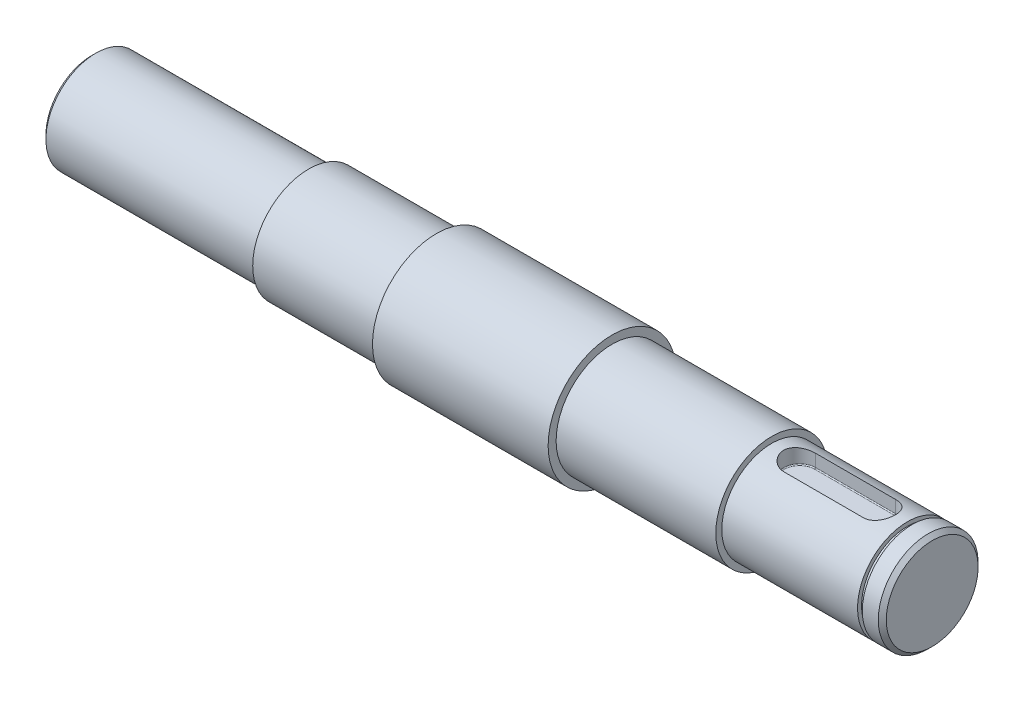
ISO-10303-21;
HEADER;
FILE_DESCRIPTION(('STEP AP214'),'2;1');
FILE_NAME('part.step','',(''),(''),'','','');
FILE_SCHEMA(('AUTOMOTIVE_DESIGN { 1 0 10303 214 1 1 1 1 }'));
ENDSEC;
DATA;
#1=APPLICATION_CONTEXT('core data for automotive mechanical design processes');
#2=APPLICATION_PROTOCOL_DEFINITION('international standard','automotive_design',2000,#1);
#3=PRODUCT_CONTEXT('',#1,'mechanical');
#4=PRODUCT('Part','Part','',(#3));
#5=PRODUCT_RELATED_PRODUCT_CATEGORY('part','',(#4));
#6=PRODUCT_DEFINITION_FORMATION('','',#4);
#7=PRODUCT_DEFINITION_CONTEXT('part definition',#1,'design');
#8=PRODUCT_DEFINITION('design','',#6,#7);
#9=PRODUCT_DEFINITION_SHAPE('','',#8);
#10=(LENGTH_UNIT() NAMED_UNIT(*) SI_UNIT(.MILLI.,.METRE.));
#11=(NAMED_UNIT(*) PLANE_ANGLE_UNIT() SI_UNIT($,.RADIAN.));
#12=(NAMED_UNIT(*) SI_UNIT($,.STERADIAN.) SOLID_ANGLE_UNIT());
#13=UNCERTAINTY_MEASURE_WITH_UNIT(LENGTH_MEASURE(1.E-05),#10,'distance_accuracy_value','');
#14=(GEOMETRIC_REPRESENTATION_CONTEXT(3) GLOBAL_UNCERTAINTY_ASSIGNED_CONTEXT((#13)) GLOBAL_UNIT_ASSIGNED_CONTEXT((#10,
#11,#12)) REPRESENTATION_CONTEXT('',''));
#15=CARTESIAN_POINT('',(0.,0.,0.));
#16=DIRECTION('',(0.,0.,1.));
#17=DIRECTION('',(1.,0.,0.));
#18=AXIS2_PLACEMENT_3D('',#15,#16,#17);
#19=CARTESIAN_POINT('',(210.,0.,0.));
#20=DIRECTION('',(-1.,0.,0.));
#21=DIRECTION('',(0.,0.,-1.));
#22=AXIS2_PLACEMENT_3D('',#19,#20,#21);
#23=CONICAL_SURFACE('',#22,12.,0.785398163397448);
#24=CARTESIAN_POINT('',(210.5,0.,0.));
#25=DIRECTION('',(1.,0.,0.));
#26=DIRECTION('',(0.,0.,1.));
#27=AXIS2_PLACEMENT_3D('',#24,#25,#26);
#28=CIRCLE('',#27,11.5);
#29=CARTESIAN_POINT('',(210.5,0.,11.5));
#30=VERTEX_POINT('',#29);
#31=EDGE_CURVE('E193',#30,#30,#28,.T.);
#32=ORIENTED_EDGE('',*,*,#31,.F.);
#33=EDGE_LOOP('',(#32));
#34=FACE_BOUND('',#33,.T.);
#35=CARTESIAN_POINT('',(209.5,0.,0.));
#36=DIRECTION('',(1.,0.,0.));
#37=DIRECTION('',(0.,0.,1.));
#38=AXIS2_PLACEMENT_3D('',#35,#36,#37);
#39=CIRCLE('',#38,12.5);
#40=CARTESIAN_POINT('',(209.5,0.,12.5));
#41=VERTEX_POINT('',#40);
#42=EDGE_CURVE('E280',#41,#41,#39,.T.);
#43=ORIENTED_EDGE('',*,*,#42,.T.);
#44=EDGE_LOOP('',(#43));
#45=FACE_BOUND('',#44,.T.);
#46=ADVANCED_FACE('F16',(#34,#45),#23,.T.);
#47=CARTESIAN_POINT('',(0.,0.,0.));
#48=DIRECTION('',(-1.,0.,0.));
#49=DIRECTION('',(0.,1.,0.));
#50=AXIS2_PLACEMENT_3D('',#47,#48,#49);
#51=PLANE('',#50);
#52=CARTESIAN_POINT('',(0.,0.,0.));
#53=DIRECTION('',(-1.,0.,0.));
#54=DIRECTION('',(0.,0.,-1.));
#55=AXIS2_PLACEMENT_3D('',#52,#53,#54);
#56=CIRCLE('',#55,11.5);
#57=CARTESIAN_POINT('',(0.,0.,-11.5));
#58=VERTEX_POINT('',#57);
#59=EDGE_CURVE('E10',#58,#58,#56,.T.);
#60=ORIENTED_EDGE('',*,*,#59,.T.);
#61=EDGE_LOOP('',(#60));
#62=FACE_BOUND('',#61,.T.);
#63=ADVANCED_FACE('F310',(#62),#51,.T.);
#64=CARTESIAN_POINT('',(0.5,0.,0.));
#65=DIRECTION('',(1.,0.,0.));
#66=DIRECTION('',(0.,0.,1.));
#67=AXIS2_PLACEMENT_3D('',#64,#65,#66);
#68=CONICAL_SURFACE('',#67,12.,0.785398163397448);
#69=CARTESIAN_POINT('',(1.,0.,0.));
#70=DIRECTION('',(-1.,0.,0.));
#71=DIRECTION('',(0.,0.,-1.));
#72=AXIS2_PLACEMENT_3D('',#69,#70,#71);
#73=CIRCLE('',#72,12.5);
#74=CARTESIAN_POINT('',(1.,0.,-12.5));
#75=VERTEX_POINT('',#74);
#76=EDGE_CURVE('E25',#75,#75,#73,.T.);
#77=ORIENTED_EDGE('',*,*,#76,.T.);
#78=EDGE_LOOP('',(#77));
#79=FACE_BOUND('',#78,.T.);
#80=ORIENTED_EDGE('',*,*,#59,.F.);
#81=EDGE_LOOP('',(#80));
#82=FACE_BOUND('',#81,.T.);
#83=ADVANCED_FACE('F306',(#79,#82),#68,.T.);
#84=CARTESIAN_POINT('',(54.3,0.,0.));
#85=DIRECTION('',(-1.,0.,0.));
#86=DIRECTION('',(0.,0.,-1.));
#87=AXIS2_PLACEMENT_3D('',#84,#85,#86);
#88=CYLINDRICAL_SURFACE('',#87,12.5);
#89=CARTESIAN_POINT('',(54.3,0.,0.));
#90=DIRECTION('',(1.,0.,0.));
#91=DIRECTION('',(0.,0.,-1.));
#92=AXIS2_PLACEMENT_3D('',#89,#90,#91);
#93=CIRCLE('',#92,12.5);
#94=CARTESIAN_POINT('',(54.3,0.,-12.5));
#95=VERTEX_POINT('',#94);
#96=EDGE_CURVE('E19',#95,#95,#93,.T.);
#97=ORIENTED_EDGE('',*,*,#96,.F.);
#98=EDGE_LOOP('',(#97));
#99=FACE_BOUND('',#98,.T.);
#100=ORIENTED_EDGE('',*,*,#76,.F.);
#101=EDGE_LOOP('',(#100));
#102=FACE_BOUND('',#101,.T.);
#103=ADVANCED_FACE('F299',(#99,#102),#88,.T.);
#104=CARTESIAN_POINT('',(54.3,0.,0.));
#105=DIRECTION('',(1.,0.,0.));
#106=DIRECTION('',(0.,0.,-1.));
#107=AXIS2_PLACEMENT_3D('',#104,#105,#106);
#108=PLANE('',#107);
#109=ORIENTED_EDGE('',*,*,#96,.T.);
#110=EDGE_LOOP('',(#109));
#111=FACE_BOUND('',#110,.T.);
#112=CARTESIAN_POINT('',(54.3,0.,0.));
#113=DIRECTION('',(1.,0.,0.));
#114=DIRECTION('',(0.,0.,1.));
#115=AXIS2_PLACEMENT_3D('',#112,#113,#114);
#116=CIRCLE('',#115,14.);
#117=CARTESIAN_POINT('',(54.3,0.,14.));
#118=VERTEX_POINT('',#117);
#119=EDGE_CURVE('E190',#118,#118,#116,.T.);
#120=ORIENTED_EDGE('',*,*,#119,.F.);
#121=EDGE_LOOP('',(#120));
#122=FACE_BOUND('',#121,.T.);
#123=ADVANCED_FACE('F294',(#111,#122),#108,.F.);
#124=CARTESIAN_POINT('',(54.3,0.,0.));
#125=DIRECTION('',(1.,0.,0.));
#126=DIRECTION('',(0.,0.,1.));
#127=AXIS2_PLACEMENT_3D('',#124,#125,#126);
#128=CYLINDRICAL_SURFACE('',#127,14.);
#129=CARTESIAN_POINT('',(86.3,0.,0.));
#130=DIRECTION('',(1.,0.,0.));
#131=DIRECTION('',(0.,0.,1.));
#132=AXIS2_PLACEMENT_3D('',#129,#130,#131);
#133=CIRCLE('',#132,14.);
#134=CARTESIAN_POINT('',(86.3,0.,14.));
#135=VERTEX_POINT('',#134);
#136=EDGE_CURVE('E248',#135,#135,#133,.T.);
#137=ORIENTED_EDGE('',*,*,#136,.F.);
#138=EDGE_LOOP('',(#137));
#139=FACE_BOUND('',#138,.T.);
#140=ORIENTED_EDGE('',*,*,#119,.T.);
#141=EDGE_LOOP('',(#140));
#142=FACE_BOUND('',#141,.T.);
#143=ADVANCED_FACE('F290',(#139,#142),#128,.T.);
#144=CARTESIAN_POINT('',(210.5,0.,0.));
#145=DIRECTION('',(1.,0.,0.));
#146=DIRECTION('',(0.,0.,-1.));
#147=AXIS2_PLACEMENT_3D('',#144,#145,#146);
#148=PLANE('',#147);
#149=ORIENTED_EDGE('',*,*,#31,.T.);
#150=EDGE_LOOP('',(#149));
#151=FACE_BOUND('',#150,.T.);
#152=ADVANCED_FACE('F293',(#151),#148,.T.);
#153=CARTESIAN_POINT('',(86.3,0.,0.));
#154=DIRECTION('',(1.,0.,0.));
#155=DIRECTION('',(0.,0.,-1.));
#156=AXIS2_PLACEMENT_3D('',#153,#154,#155);
#157=PLANE('',#156);
#158=ORIENTED_EDGE('',*,*,#136,.T.);
#159=EDGE_LOOP('',(#158));
#160=FACE_BOUND('',#159,.T.);
#161=CARTESIAN_POINT('',(86.3,0.,0.));
#162=DIRECTION('',(1.,0.,0.));
#163=DIRECTION('',(0.,0.,1.));
#164=AXIS2_PLACEMENT_3D('',#161,#162,#163);
#165=CIRCLE('',#164,16.);
#166=CARTESIAN_POINT('',(86.3,0.,16.));
#167=VERTEX_POINT('',#166);
#168=EDGE_CURVE('E277',#167,#167,#165,.T.);
#169=ORIENTED_EDGE('',*,*,#168,.F.);
#170=EDGE_LOOP('',(#169));
#171=FACE_BOUND('',#170,.T.);
#172=ADVANCED_FACE('F287',(#160,#171),#157,.F.);
#173=CARTESIAN_POINT('',(205.5,0.,0.));
#174=DIRECTION('',(1.,0.,0.));
#175=DIRECTION('',(0.,0.,1.));
#176=AXIS2_PLACEMENT_3D('',#173,#174,#175);
#177=CYLINDRICAL_SURFACE('',#176,12.5);
#178=ORIENTED_EDGE('',*,*,#42,.F.);
#179=EDGE_LOOP('',(#178));
#180=FACE_BOUND('',#179,.T.);
#181=CARTESIAN_POINT('',(205.5,0.,0.));
#182=DIRECTION('',(1.,0.,0.));
#183=DIRECTION('',(0.,0.,1.));
#184=AXIS2_PLACEMENT_3D('',#181,#182,#183);
#185=CIRCLE('',#184,12.5);
#186=CARTESIAN_POINT('',(205.5,0.,12.5));
#187=VERTEX_POINT('',#186);
#188=EDGE_CURVE('E274',#187,#187,#185,.T.);
#189=ORIENTED_EDGE('',*,*,#188,.T.);
#190=EDGE_LOOP('',(#189));
#191=FACE_BOUND('',#190,.T.);
#192=ADVANCED_FACE('F319',(#180,#191),#177,.T.);
#193=CARTESIAN_POINT('',(86.3,0.,0.));
#194=DIRECTION('',(1.,0.,0.));
#195=DIRECTION('',(0.,0.,1.));
#196=AXIS2_PLACEMENT_3D('',#193,#194,#195);
#197=CYLINDRICAL_SURFACE('',#196,16.);
#198=CARTESIAN_POINT('',(130.3,0.,0.));
#199=DIRECTION('',(1.,0.,0.));
#200=DIRECTION('',(0.,0.,1.));
#201=AXIS2_PLACEMENT_3D('',#198,#199,#200);
#202=CIRCLE('',#201,16.);
#203=CARTESIAN_POINT('',(130.3,0.,16.));
#204=VERTEX_POINT('',#203);
#205=EDGE_CURVE('E270',#204,#204,#202,.T.);
#206=ORIENTED_EDGE('',*,*,#205,.F.);
#207=EDGE_LOOP('',(#206));
#208=FACE_BOUND('',#207,.T.);
#209=ORIENTED_EDGE('',*,*,#168,.T.);
#210=EDGE_LOOP('',(#209));
#211=FACE_BOUND('',#210,.T.);
#212=ADVANCED_FACE('F322',(#208,#211),#197,.T.);
#213=CARTESIAN_POINT('',(205.5,0.,0.));
#214=DIRECTION('',(1.,0.,0.));
#215=DIRECTION('',(0.,0.,-1.));
#216=AXIS2_PLACEMENT_3D('',#213,#214,#215);
#217=PLANE('',#216);
#218=CARTESIAN_POINT('',(205.5,0.,0.));
#219=DIRECTION('',(1.,0.,0.));
#220=DIRECTION('',(0.,0.,1.));
#221=AXIS2_PLACEMENT_3D('',#218,#219,#220);
#222=CIRCLE('',#221,11.5);
#223=CARTESIAN_POINT('',(205.5,0.,11.5));
#224=VERTEX_POINT('',#223);
#225=EDGE_CURVE('E268',#224,#224,#222,.T.);
#226=ORIENTED_EDGE('',*,*,#225,.T.);
#227=EDGE_LOOP('',(#226));
#228=FACE_BOUND('',#227,.T.);
#229=ORIENTED_EDGE('',*,*,#188,.F.);
#230=EDGE_LOOP('',(#229));
#231=FACE_BOUND('',#230,.T.);
#232=ADVANCED_FACE('F326',(#228,#231),#217,.F.);
#233=CARTESIAN_POINT('',(130.3,0.,0.));
#234=DIRECTION('',(1.,0.,0.));
#235=DIRECTION('',(0.,0.,-1.));
#236=AXIS2_PLACEMENT_3D('',#233,#234,#235);
#237=PLANE('',#236);
#238=CARTESIAN_POINT('',(130.3,0.,0.));
#239=DIRECTION('',(1.,0.,0.));
#240=DIRECTION('',(0.,0.,1.));
#241=AXIS2_PLACEMENT_3D('',#238,#239,#240);
#242=CIRCLE('',#241,14.);
#243=CARTESIAN_POINT('',(130.3,0.,14.));
#244=VERTEX_POINT('',#243);
#245=EDGE_CURVE('E265',#244,#244,#242,.T.);
#246=ORIENTED_EDGE('',*,*,#245,.F.);
#247=EDGE_LOOP('',(#246));
#248=FACE_BOUND('',#247,.T.);
#249=ORIENTED_EDGE('',*,*,#205,.T.);
#250=EDGE_LOOP('',(#249));
#251=FACE_BOUND('',#250,.T.);
#252=ADVANCED_FACE('F328',(#248,#251),#237,.T.);
#253=CARTESIAN_POINT('',(204.3,0.,0.));
#254=DIRECTION('',(1.,0.,0.));
#255=DIRECTION('',(0.,0.,1.));
#256=AXIS2_PLACEMENT_3D('',#253,#254,#255);
#257=CYLINDRICAL_SURFACE('',#256,11.5);
#258=ORIENTED_EDGE('',*,*,#225,.F.);
#259=EDGE_LOOP('',(#258));
#260=FACE_BOUND('',#259,.T.);
#261=CARTESIAN_POINT('',(204.3,0.,0.));
#262=DIRECTION('',(1.,0.,0.));
#263=DIRECTION('',(0.,0.,1.));
#264=AXIS2_PLACEMENT_3D('',#261,#262,#263);
#265=CIRCLE('',#264,11.5);
#266=CARTESIAN_POINT('',(204.3,0.,11.5));
#267=VERTEX_POINT('',#266);
#268=EDGE_CURVE('E262',#267,#267,#265,.T.);
#269=ORIENTED_EDGE('',*,*,#268,.T.);
#270=EDGE_LOOP('',(#269));
#271=FACE_BOUND('',#270,.T.);
#272=ADVANCED_FACE('F335',(#260,#271),#257,.T.);
#273=CARTESIAN_POINT('',(130.3,0.,0.));
#274=DIRECTION('',(1.,0.,0.));
#275=DIRECTION('',(0.,0.,1.));
#276=AXIS2_PLACEMENT_3D('',#273,#274,#275);
#277=CYLINDRICAL_SURFACE('',#276,14.);
#278=CARTESIAN_POINT('',(170.3,0.,0.));
#279=DIRECTION('',(1.,0.,0.));
#280=DIRECTION('',(0.,0.,1.));
#281=AXIS2_PLACEMENT_3D('',#278,#279,#280);
#282=CIRCLE('',#281,14.);
#283=CARTESIAN_POINT('',(170.3,0.,14.));
#284=VERTEX_POINT('',#283);
#285=EDGE_CURVE('E259',#284,#284,#282,.T.);
#286=ORIENTED_EDGE('',*,*,#285,.F.);
#287=EDGE_LOOP('',(#286));
#288=FACE_BOUND('',#287,.T.);
#289=ORIENTED_EDGE('',*,*,#245,.T.);
#290=EDGE_LOOP('',(#289));
#291=FACE_BOUND('',#290,.T.);
#292=ADVANCED_FACE('F341',(#288,#291),#277,.T.);
#293=CARTESIAN_POINT('',(177.3,14.5,0.));
#294=DIRECTION('',(0.,-1.,0.));
#295=DIRECTION('',(0.,0.,1.));
#296=AXIS2_PLACEMENT_3D('',#293,#294,#295);
#297=CYLINDRICAL_SURFACE('',#296,4.);
#298=CARTESIAN_POINT('',(177.3,11.8427192858859,4.));
#299=CARTESIAN_POINT('',(177.284892466756,11.8427192752621,4.0000000066002));
#300=CARTESIAN_POINT('',(177.254212249326,11.842777996675,3.99982617858669));
#301=CARTESIAN_POINT('',(177.207493473476,11.8430489331777,3.99902392736786));
#302=CARTESIAN_POINT('',(177.158911811704,11.8435251742866,3.99761335533497));
#303=CARTESIAN_POINT('',(177.108471710308,11.8442304856701,3.9955232984831));
#304=CARTESIAN_POINT('',(177.05527085542,11.8452061140425,3.99263022749254));
#305=CARTESIAN_POINT('',(176.999345817949,11.8464881791008,3.98882498307456));
#306=CARTESIAN_POINT('',(176.939828209384,11.8481425176702,3.98390888612871));
#307=CARTESIAN_POINT('',(176.877693963482,11.8501895947723,3.97781640996389));
#308=CARTESIAN_POINT('',(176.812075378895,11.852703516797,3.97032039658098));
#309=CARTESIAN_POINT('',(176.742975027474,11.8557401898192,3.96124496184574));
#310=CARTESIAN_POINT('',(176.668550626588,11.8594588136524,3.95010022951007));
#311=CARTESIAN_POINT('',(176.589739078941,11.8639060675799,3.93672608047435));
#312=CARTESIAN_POINT('',(176.505724072297,11.8692217159966,3.92067426343488));
#313=CARTESIAN_POINT('',(176.417585169864,11.8754334863806,3.90182449436318));
#314=CARTESIAN_POINT('',(176.324583083993,11.8826955632336,3.8796591066339));
#315=CARTESIAN_POINT('',(176.228608353377,11.8909515068504,3.85428889686128));
#316=CARTESIAN_POINT('',(176.125416748823,11.9006688726898,3.82419473916237));
#317=CARTESIAN_POINT('',(176.011900864232,11.912361661601,3.78764494253445));
#318=CARTESIAN_POINT('',(175.879302537444,11.9273534219398,3.74022440541347));
#319=CARTESIAN_POINT('',(175.729407026826,11.9460589826312,3.68013140989381));
#320=CARTESIAN_POINT('',(175.53573252434,11.9727862259489,3.59251445457914));
#321=CARTESIAN_POINT('',(175.311825439645,12.0076032040654,3.47489008872727));
#322=CARTESIAN_POINT('',(175.06756852221,12.0505397477586,3.32320090947644));
#323=CARTESIAN_POINT('',(174.86480221771,12.0900539464116,3.17616924328622));
#324=CARTESIAN_POINT('',(174.70312435576,12.1238788743453,3.04399595699052));
#325=CARTESIAN_POINT('',(174.585170312725,12.149755874987,2.93888301933394));
#326=CARTESIAN_POINT('',(174.485427483788,12.1724811326278,2.84314557943961));
#327=CARTESIAN_POINT('',(174.402861414864,12.1918658532214,2.75874255753678));
#328=CARTESIAN_POINT('',(174.330041197925,12.2093900654748,2.68007073123344));
#329=CARTESIAN_POINT('',(174.263954147601,12.2256401500441,2.6049357120315));
#330=CARTESIAN_POINT('',(174.201272223952,12.241362703419,2.53001351594597));
#331=CARTESIAN_POINT('',(174.142160972386,12.2564643430189,2.45580549797965));
#332=CARTESIAN_POINT('',(174.085936646302,12.2710746679386,2.38172496693646));
#333=CARTESIAN_POINT('',(174.032645351703,12.2851441846673,2.30805286206815));
#334=CARTESIAN_POINT('',(173.982022040378,12.2987085394487,2.23463703708558));
#335=CARTESIAN_POINT('',(173.929374890022,12.3130101564768,2.15457377825304));
#336=CARTESIAN_POINT('',(173.87519928686,12.3279464164696,2.06755670675722));
#337=CARTESIAN_POINT('',(173.820197819244,12.3433447429019,1.97353447948223));
#338=CARTESIAN_POINT('',(173.773289947215,12.3566627451695,1.88815769454464));
#339=CARTESIAN_POINT('',(173.733335175993,12.3681336116315,1.81131592893119));
#340=CARTESIAN_POINT('',(173.699404971463,12.3779622471653,1.74288428722177));
#341=CARTESIAN_POINT('',(173.6670400184,12.3874168001104,1.67436451945002));
#342=CARTESIAN_POINT('',(173.636263853849,12.3964788789652,1.60589579335904));
#343=CARTESIAN_POINT('',(173.606958149926,12.4051727267374,1.53729733703146));
#344=CARTESIAN_POINT('',(173.578020893908,12.4138179898951,1.46591893637078));
#345=CARTESIAN_POINT('',(173.548534751305,12.4226895624473,1.38888828448684));
#346=CARTESIAN_POINT('',(173.517007446065,12.4322449563189,1.3008629954567));
#347=CARTESIAN_POINT('',(173.484216202054,12.4422612968341,1.20163623016139));
#348=CARTESIAN_POINT('',(173.451137385848,12.4524464911315,1.09132309298218));
#349=CARTESIAN_POINT('',(173.420088320964,12.4620803817568,0.975334923046066));
#350=CARTESIAN_POINT('',(173.390477329963,12.4713320730924,0.849417097911195));
#351=CARTESIAN_POINT('',(173.36492992649,12.4793672187247,0.721954193938998));
#352=CARTESIAN_POINT('',(173.344544940332,12.4858134897378,0.599010476986636));
#353=CARTESIAN_POINT('',(173.331277917536,12.490024945918,0.501697218336807));
#354=CARTESIAN_POINT('',(173.322421245672,12.4928427174447,0.424518080983762));
#355=CARTESIAN_POINT('',(173.316261344746,12.4948054939283,0.362091034234716));
#356=CARTESIAN_POINT('',(173.31118806648,12.4964240692941,0.300991135102331));
#357=CARTESIAN_POINT('',(173.307146176634,12.4977149076161,0.241415904567377));
#358=CARTESIAN_POINT('',(173.304036851482,12.4987087096093,0.182774470852509));
#359=CARTESIAN_POINT('',(173.301745996088,12.4994413495439,0.123193172201234));
#360=CARTESIAN_POINT('',(173.300323111578,12.4998965988717,0.0622971889286511));
#361=CARTESIAN_POINT('',(173.299986632885,12.5000042774489,0.0190073821308869));
#362=CARTESIAN_POINT('',(173.300017627936,12.4999943591438,-0.0290538366999461));
#363=CARTESIAN_POINT('',(173.300611377066,12.499804345621,-0.0835474518488521));
#364=CARTESIAN_POINT('',(173.303398555554,12.4989127082237,-0.17434981996257));
#365=CARTESIAN_POINT('',(173.308983654857,12.4971274309324,-0.275526822370817));
#366=CARTESIAN_POINT('',(173.317954345777,12.4942649647029,-0.383415945096931));
#367=CARTESIAN_POINT('',(173.327920947617,12.4910920373344,-0.474259392613104));
#368=CARTESIAN_POINT('',(173.337635040539,12.4880068363431,-0.548558025613074));
#369=CARTESIAN_POINT('',(173.346197166626,12.4852927227441,-0.607060230835405));
#370=CARTESIAN_POINT('',(173.355156785202,12.4824582116473,-0.662740582128882));
#371=CARTESIAN_POINT('',(173.364915144854,12.4793774301058,-0.718476246993997));
#372=CARTESIAN_POINT('',(173.375979294695,12.4758926034321,-0.776731340873844));
#373=CARTESIAN_POINT('',(173.388867442942,12.4718443075685,-0.839345925495769));
#374=CARTESIAN_POINT('',(173.403709353992,12.4671971144693,-0.905862854158743));
#375=CARTESIAN_POINT('',(173.423457094917,12.4610366875257,-0.987542528589657));
#376=CARTESIAN_POINT('',(173.449260674908,12.4530279731438,-1.08451458418036));
#377=CARTESIAN_POINT('',(173.48294090577,12.4426500050685,-1.1979298390569));
#378=CARTESIAN_POINT('',(173.51911435527,12.4315996300285,-1.30737731502847));
#379=CARTESIAN_POINT('',(173.556837683888,12.4201797272635,-1.41148031393508));
#380=CARTESIAN_POINT('',(173.595089726379,12.4087014317319,-1.50911343603032));
#381=CARTESIAN_POINT('',(173.636923132369,12.3962716499521,-1.60804660624064));
#382=CARTESIAN_POINT('',(173.682064323075,12.3830043603179,-1.70719517092052));
#383=CARTESIAN_POINT('',(173.729888888516,12.3691130187255,-1.80506312765269));
#384=CARTESIAN_POINT('',(173.779863543443,12.3547790658151,-1.90064962239506));
#385=CARTESIAN_POINT('',(173.831577106812,12.3401424105648,-1.99342055947352));
#386=CARTESIAN_POINT('',(173.889726890639,12.3239115833508,-2.09158124031287));
#387=CARTESIAN_POINT('',(173.954775769275,12.3060532753542,-2.19434103684972));
#388=CARTESIAN_POINT('',(174.027005734774,12.2866124148119,-2.30062232253016));
#389=CARTESIAN_POINT('',(174.094685734212,12.26876963804,-2.39372226197033));
#390=CARTESIAN_POINT('',(174.157357183993,12.2525589515004,-2.47519705833714));
#391=CARTESIAN_POINT('',(174.215014569744,12.237894747636,-2.54669935387715));
#392=CARTESIAN_POINT('',(174.274510026335,12.2230292834305,-2.61710914779065));
#393=CARTESIAN_POINT('',(174.343780509585,12.2060432322161,-2.69534519365335));
#394=CARTESIAN_POINT('',(174.424209921782,12.1867795149854,-2.78127234019983));
#395=CARTESIAN_POINT('',(174.517350495478,12.1651238647946,-2.87450762856065));
#396=CARTESIAN_POINT('',(174.610899040896,12.1440714915068,-2.96210544028571));
#397=CARTESIAN_POINT('',(174.707217859563,12.1231040920882,-3.04674852974406));
#398=CARTESIAN_POINT('',(174.81249271574,12.1009725462022,-3.13359583908226));
#399=CARTESIAN_POINT('',(174.935726405192,12.0761746812981,-3.2279239834804));
#400=CARTESIAN_POINT('',(175.078109710028,12.0490464532734,-3.32778001969339));
#401=CARTESIAN_POINT('',(175.233015339194,12.0213977299774,-3.42628236861397));
#402=CARTESIAN_POINT('',(175.393357324686,11.9948679532875,-3.51793686202126));
#403=CARTESIAN_POINT('',(175.550746852031,11.9708883114171,-3.59858956657524));
#404=CARTESIAN_POINT('',(175.696208004798,11.9505566384431,-3.6654500640063));
#405=CARTESIAN_POINT('',(175.828022284796,11.9336406771165,-3.72009036228425));
#406=CARTESIAN_POINT('',(175.944740461464,11.9198437629818,-3.76402748881944));
#407=CARTESIAN_POINT('',(176.053689077377,11.9079666578939,-3.80141592066339));
#408=CARTESIAN_POINT('',(176.158435725327,11.8974595450018,-3.83416399303404));
#409=CARTESIAN_POINT('',(176.263184116877,11.8878663641276,-3.86379645996945));
#410=CARTESIAN_POINT('',(176.367681365247,11.8792089365433,-3.89032459690037));
#411=CARTESIAN_POINT('',(176.472117046289,11.8714692269176,-3.91387247183114));
#412=CARTESIAN_POINT('',(176.576354126293,11.8646557097493,-3.93447331367671));
#413=CARTESIAN_POINT('',(176.680552759969,11.8587568388097,-3.95221257903597));
#414=CARTESIAN_POINT('',(176.784480095539,11.8537830881747,-3.96710138909897));
#415=CARTESIAN_POINT('',(176.888210259368,11.8497258213912,-3.97920092709286));
#416=CARTESIAN_POINT('',(176.991548045442,11.8465858015131,-3.98853708913172));
#417=CARTESIAN_POINT('',(177.094605834538,11.8443515099887,-3.99516542506536));
#418=CARTESIAN_POINT('',(177.197349334327,11.8430159868525,-3.99912192777));
#419=CARTESIAN_POINT('',(177.265812567557,11.8427190883927,-4.00000011335332));
#420=CARTESIAN_POINT('',(177.3,11.842719282327,-4.));
#421=(BOUNDED_CURVE() B_SPLINE_CURVE(3,(#298,#299,#300,#301,#302,#303,#304,#305,#306,#307,#308,
#309,#310,#311,#312,#313,#314,#315,#316,#317,#318,#319,#320,#321,#322,#323,#324,#325,#326,#327,
#328,#329,#330,#331,#332,#333,#334,#335,#336,#337,#338,#339,#340,#341,#342,#343,#344,#345,#346,
#347,#348,#349,#350,#351,#352,#353,#354,#355,#356,#357,#358,#359,#360,#361,#362,#363,#364,#365,
#366,#367,#368,#369,#370,#371,#372,#373,#374,#375,#376,#377,#378,#379,#380,#381,#382,#383,#384,
#385,#386,#387,#388,#389,#390,#391,#392,#393,#394,#395,#396,#397,#398,#399,#400,#401,#402,#403,
#404,#405,#406,#407,#408,#409,#410,#411,#412,#413,#414,#415,#416,#417,#418,#419,#420),
.UNSPECIFIED.,.F.,.F.) B_SPLINE_CURVE_WITH_KNOTS((4,1,1,1,1,1,1,1,1,1,1,1,1,1,1,1,1,1,1,1,1,1,1,
1,1,1,1,1,1,1,1,1,1,1,1,1,1,1,1,1,1,1,1,1,1,1,1,1,1,1,1,1,1,1,1,1,1,1,1,1,1,1,1,1,1,1,1,1,1,1,1,
1,1,1,1,1,1,1,1,1,1,1,1,1,1,1,1,1,1,1,1,1,1,1,1,1,1,1,1,1,1,1,1,1,1,1,1,1,1,1,1,1,1,1,1,1,1,1,1,
1,4),(-1.,-0.996416806723242,-0.99272317868215,-0.988917249221331,-0.984888475164702,
-0.980747972035001,-0.976277932916546,-0.971589939198839,-0.966578585417238,-0.961463809246652,
-0.955916912748038,-0.950037284168522,-0.943598892187371,-0.936934542299673,-0.92971826439535,
-0.922178328282538,-0.914200899040319,-0.90609900517444,-0.896585765859637,-0.885786842071506,
-0.872518800699808,-0.858041191126521,-0.834996106839277,-0.81201580666315,-0.789138166061547,
-0.774902433967828,-0.761861596226659,-0.751180432165616,-0.741681232080627,-0.7334896527908,
-0.725422663365072,-0.717642206390015,-0.710027233536421,-0.702641802795338,-0.695318334601454,
-0.688209592242237,-0.681252300772774,-0.672344757064432,-0.663647538943654,-0.655166602559427,
-0.649031182424169,-0.642931235336058,-0.636905854436567,-0.630923561463703,-0.625002391347677,
-0.619098179530093,-0.612545691198954,-0.60533158470823,-0.596811593583251,-0.587652069820478,
-0.577917178114499,-0.568249404069927,-0.556903044205921,-0.547038796903134,-0.538667976074738,
-0.533600817461991,-0.528610883285065,-0.523789798322602,-0.519060776579133,-0.514450437046937,
-0.509863692782874,-0.504920211037662,-0.500004033852231,-0.499596131867822,-0.493520787147745,
-0.487078539226003,-0.478049219303636,-0.469488169866051,-0.46140210735165,-0.456370870684718,
-0.451708827996781,-0.447369956784104,-0.442983100385897,-0.438273109047098,-0.433286093445291,
-0.427794719032217,-0.422075390685358,-0.413306702566987,-0.403926082446108,-0.393915727869711,
-0.38585095187059,-0.377532685853802,-0.36890470602601,-0.360212746147744,-0.351510924053649,
-0.342867472858234,-0.33441249369401,-0.326088775414316,-0.31554166583765,-0.30526650870835,
-0.295272828091711,-0.287923973606097,-0.280591140139303,-0.273216373432412,-0.265783107958755,
-0.255486932747533,-0.244937193644838,-0.234114930188998,-0.224691252416164,-0.214128485145462,
-0.201332804738686,-0.187430109941866,-0.172400329170309,-0.15732155084092,-0.143191825982805,
-0.130085055881571,-0.119062492428964,-0.109126193799289,-0.100337879335829,-0.0916088801883742,
-0.0829869120752411,-0.0744255597866595,-0.0659591823250127,-0.0575278064354733,
-0.0491666942802796,-0.0408423227307068,-0.0325904581699062,-0.0243727757551085,
-0.0162209324968593,-0.00809757763245079,0.),
.UNSPECIFIED.) CURVE() GEOMETRIC_REPRESENTATION_ITEM() RATIONAL_B_SPLINE_CURVE((1.,1.,1.,1.,1.,
1.,1.,1.,1.,1.,1.,1.,1.,1.,1.,1.,1.,1.,1.,1.,1.,1.,1.,1.,1.,1.,1.,1.,1.,1.,1.,1.,1.,1.,1.,1.,1.,
1.,1.,1.,1.,1.,1.,1.,1.,1.,1.,1.,1.,1.,1.,1.,1.,1.,1.,1.,1.,1.,1.,1.,1.,1.,1.,1.,1.,1.,1.,1.,1.,
1.,1.,1.,1.,1.,1.,1.,1.,1.,1.,1.,1.,1.,1.,1.,1.,1.,1.,1.,1.,1.,1.,1.,1.,1.,1.,1.,1.,1.,1.,1.,1.,
1.,1.,1.,1.,1.,1.,1.,1.,1.,1.,1.,1.,1.,1.,1.,1.,1.,1.,1.,1.,1.,1.)) REPRESENTATION_ITEM(''));
#422=CARTESIAN_POINT('',(177.3,11.842719282327,4.));
#423=VERTEX_POINT('',#422);
#424=CARTESIAN_POINT('',(177.3,11.842719282327,-4.));
#425=VERTEX_POINT('',#424);
#426=EDGE_CURVE('E198',#423,#425,#421,.T.);
#427=ORIENTED_EDGE('',*,*,#426,.F.);
#428=DIRECTION('',(0.,1.,0.));
#429=VECTOR('',#428,1.);
#430=CARTESIAN_POINT('',(177.3,11.842719282327,4.));
#431=LINE('',#430,#429);
#432=CARTESIAN_POINT('',(177.3,8.75,4.));
#433=VERTEX_POINT('',#432);
#434=EDGE_CURVE('E161',#433,#423,#431,.T.);
#435=ORIENTED_EDGE('',*,*,#434,.F.);
#436=CARTESIAN_POINT('',(177.3,8.75,0.));
#437=DIRECTION('',(0.,-1.,0.));
#438=DIRECTION('',(0.,0.,1.));
#439=AXIS2_PLACEMENT_3D('',#436,#437,#438);
#440=CIRCLE('',#439,4.);
#441=CARTESIAN_POINT('',(177.3,8.75,-4.));
#442=VERTEX_POINT('',#441);
#443=EDGE_CURVE('E256',#433,#442,#440,.T.);
#444=ORIENTED_EDGE('',*,*,#443,.T.);
#445=DIRECTION('',(0.,-1.,0.));
#446=VECTOR('',#445,1.);
#447=CARTESIAN_POINT('',(177.3,11.842719282327,-4.));
#448=LINE('',#447,#446);
#449=EDGE_CURVE('E202',#425,#442,#448,.T.);
#450=ORIENTED_EDGE('',*,*,#449,.F.);
#451=EDGE_LOOP('',(#427,#435,#444,#450));
#452=FACE_BOUND('',#451,.T.);
#453=ADVANCED_FACE('F409',(#452),#297,.F.);
#454=CARTESIAN_POINT('',(204.3,0.,0.));
#455=DIRECTION('',(1.,0.,0.));
#456=DIRECTION('',(0.,0.,-1.));
#457=AXIS2_PLACEMENT_3D('',#454,#455,#456);
#458=PLANE('',#457);
#459=ORIENTED_EDGE('',*,*,#268,.F.);
#460=EDGE_LOOP('',(#459));
#461=FACE_BOUND('',#460,.T.);
#462=CARTESIAN_POINT('',(204.3,0.,0.));
#463=DIRECTION('',(1.,0.,0.));
#464=DIRECTION('',(0.,0.,1.));
#465=AXIS2_PLACEMENT_3D('',#462,#463,#464);
#466=CIRCLE('',#465,12.5);
#467=CARTESIAN_POINT('',(204.3,0.,12.5));
#468=VERTEX_POINT('',#467);
#469=EDGE_CURVE('E188',#468,#468,#466,.T.);
#470=ORIENTED_EDGE('',*,*,#469,.T.);
#471=EDGE_LOOP('',(#470));
#472=FACE_BOUND('',#471,.T.);
#473=ADVANCED_FACE('F420',(#461,#472),#458,.T.);
#474=CARTESIAN_POINT('',(170.3,0.,0.));
#475=DIRECTION('',(1.,0.,0.));
#476=DIRECTION('',(0.,0.,-1.));
#477=AXIS2_PLACEMENT_3D('',#474,#475,#476);
#478=PLANE('',#477);
#479=CARTESIAN_POINT('',(170.3,0.,0.));
#480=DIRECTION('',(1.,0.,0.));
#481=DIRECTION('',(0.,0.,1.));
#482=AXIS2_PLACEMENT_3D('',#479,#480,#481);
#483=CIRCLE('',#482,12.5);
#484=CARTESIAN_POINT('',(170.3,0.,12.5));
#485=VERTEX_POINT('',#484);
#486=EDGE_CURVE('E171',#485,#485,#483,.T.);
#487=ORIENTED_EDGE('',*,*,#486,.F.);
#488=EDGE_LOOP('',(#487));
#489=FACE_BOUND('',#488,.T.);
#490=ORIENTED_EDGE('',*,*,#285,.T.);
#491=EDGE_LOOP('',(#490));
#492=FACE_BOUND('',#491,.T.);
#493=ADVANCED_FACE('F431',(#489,#492),#478,.T.);
#494=CARTESIAN_POINT('',(177.3,8.75,0.));
#495=DIRECTION('',(0.,-1.,0.));
#496=DIRECTION('',(0.,0.,1.));
#497=AXIS2_PLACEMENT_3D('',#494,#495,#496);
#498=TOROIDAL_SURFACE('',#497,3.75,0.25);
#499=CARTESIAN_POINT('',(177.3,8.75,3.75));
#500=DIRECTION('',(-1.,0.,0.));
#501=DIRECTION('',(0.,-1.,0.));
#502=AXIS2_PLACEMENT_3D('',#499,#500,#501);
#503=CIRCLE('',#502,0.25);
#504=CARTESIAN_POINT('',(177.3,8.5,3.75));
#505=VERTEX_POINT('',#504);
#506=EDGE_CURVE('E244',#505,#433,#503,.T.);
#507=ORIENTED_EDGE('',*,*,#506,.F.);
#508=CARTESIAN_POINT('',(177.3,8.5,0.));
#509=DIRECTION('',(0.,-1.,0.));
#510=DIRECTION('',(0.,0.,1.));
#511=AXIS2_PLACEMENT_3D('',#508,#509,#510);
#512=CIRCLE('',#511,3.75);
#513=CARTESIAN_POINT('',(177.3,8.5,-3.75));
#514=VERTEX_POINT('',#513);
#515=EDGE_CURVE('E177',#505,#514,#512,.T.);
#516=ORIENTED_EDGE('',*,*,#515,.T.);
#517=CARTESIAN_POINT('',(177.3,8.75,-3.75));
#518=DIRECTION('',(-1.,0.,0.));
#519=DIRECTION('',(0.,0.,-1.));
#520=AXIS2_PLACEMENT_3D('',#517,#518,#519);
#521=CIRCLE('',#520,0.25);
#522=EDGE_CURVE('E160',#442,#514,#521,.T.);
#523=ORIENTED_EDGE('',*,*,#522,.F.);
#524=ORIENTED_EDGE('',*,*,#443,.F.);
#525=EDGE_LOOP('',(#507,#516,#523,#524));
#526=FACE_BOUND('',#525,.T.);
#527=ADVANCED_FACE('F441',(#526),#498,.F.);
#528=CARTESIAN_POINT('',(197.3,8.75,0.));
#529=DIRECTION('',(0.,-1.,0.));
#530=DIRECTION('',(0.,0.,-1.));
#531=AXIS2_PLACEMENT_3D('',#528,#529,#530);
#532=TOROIDAL_SURFACE('',#531,3.75,0.25);
#533=CARTESIAN_POINT('',(197.3,8.75,-3.75));
#534=DIRECTION('',(1.,0.,0.));
#535=DIRECTION('',(0.,0.,-1.));
#536=AXIS2_PLACEMENT_3D('',#533,#534,#535);
#537=CIRCLE('',#536,0.25);
#538=CARTESIAN_POINT('',(197.3,8.5,-3.75));
#539=VERTEX_POINT('',#538);
#540=CARTESIAN_POINT('',(197.3,8.75,-4.));
#541=VERTEX_POINT('',#540);
#542=EDGE_CURVE('E148',#539,#541,#537,.T.);
#543=ORIENTED_EDGE('',*,*,#542,.F.);
#544=CARTESIAN_POINT('',(197.3,8.5,0.));
#545=DIRECTION('',(0.,-1.,0.));
#546=DIRECTION('',(0.,0.,-1.));
#547=AXIS2_PLACEMENT_3D('',#544,#545,#546);
#548=CIRCLE('',#547,3.75);
#549=CARTESIAN_POINT('',(197.3,8.5,3.75));
#550=VERTEX_POINT('',#549);
#551=EDGE_CURVE('E152',#539,#550,#548,.T.);
#552=ORIENTED_EDGE('',*,*,#551,.T.);
#553=CARTESIAN_POINT('',(197.3,8.75,3.75));
#554=DIRECTION('',(1.,0.,0.));
#555=DIRECTION('',(0.,-1.,0.));
#556=AXIS2_PLACEMENT_3D('',#553,#554,#555);
#557=CIRCLE('',#556,0.25);
#558=CARTESIAN_POINT('',(197.3,8.75,4.));
#559=VERTEX_POINT('',#558);
#560=EDGE_CURVE('E242',#559,#550,#557,.T.);
#561=ORIENTED_EDGE('',*,*,#560,.F.);
#562=CARTESIAN_POINT('',(197.3,8.75,0.));
#563=DIRECTION('',(0.,-1.,0.));
#564=DIRECTION('',(0.,0.,-1.));
#565=AXIS2_PLACEMENT_3D('',#562,#563,#564);
#566=CIRCLE('',#565,4.);
#567=EDGE_CURVE('E154',#541,#559,#566,.T.);
#568=ORIENTED_EDGE('',*,*,#567,.F.);
#569=EDGE_LOOP('',(#543,#552,#561,#568));
#570=FACE_BOUND('',#569,.T.);
#571=ADVANCED_FACE('F150',(#570),#532,.F.);
#572=CARTESIAN_POINT('',(197.3,14.5,0.));
#573=DIRECTION('',(0.,-1.,0.));
#574=DIRECTION('',(0.,0.,-1.));
#575=AXIS2_PLACEMENT_3D('',#572,#573,#574);
#576=CYLINDRICAL_SURFACE('',#575,4.);
#577=DIRECTION('',(0.,-1.,0.));
#578=VECTOR('',#577,1.);
#579=CARTESIAN_POINT('',(197.3,11.842719282327,4.));
#580=LINE('',#579,#578);
#581=CARTESIAN_POINT('',(197.3,11.842719282327,4.));
#582=VERTEX_POINT('',#581);
#583=EDGE_CURVE('E230',#582,#559,#580,.T.);
#584=ORIENTED_EDGE('',*,*,#583,.F.);
#585=CARTESIAN_POINT('',(197.3,11.842719282327,-4.));
#586=CARTESIAN_POINT('',(197.366572983291,11.8427173227488,-4.00000104534462));
#587=CARTESIAN_POINT('',(197.486268506137,11.8437310116686,-3.99700857689943));
#588=CARTESIAN_POINT('',(197.645310451096,11.8474797296652,-3.98588517979788));
#589=CARTESIAN_POINT('',(197.777374934603,11.8521390178484,-3.97201160027344));
#590=CARTESIAN_POINT('',(197.909142904176,11.8581052195118,-3.95417463157939));
#591=CARTESIAN_POINT('',(198.053402625101,11.8663156589182,-3.92948913586729));
#592=CARTESIAN_POINT('',(198.209505493503,11.8772557773666,-3.89631599402346));
#593=CARTESIAN_POINT('',(198.351175353217,11.8890267744304,-3.86025351695425));
#594=CARTESIAN_POINT('',(198.478659990866,11.9010475141431,-3.82302546643114));
#595=CARTESIAN_POINT('',(198.592280415661,11.9128410718131,-3.7861276996521));
#596=CARTESIAN_POINT('',(198.704635220425,11.9255566442499,-3.74589645972203));
#597=CARTESIAN_POINT('',(198.819800992469,11.939653918931,-3.70074230193731));
#598=CARTESIAN_POINT('',(198.941592007298,11.955732710238,-3.64851130975933));
#599=CARTESIAN_POINT('',(199.077021406033,11.9750247380446,-3.58476729026098));
#600=CARTESIAN_POINT('',(199.224665188575,11.9977715701539,-3.50800185449272));
#601=CARTESIAN_POINT('',(199.382467741928,12.0240726857603,-3.41688576503199));
#602=CARTESIAN_POINT('',(199.541713652386,12.0526802971461,-3.31467441202992));
#603=CARTESIAN_POINT('',(199.694030036643,12.0819885414228,-3.20622733232001));
#604=CARTESIAN_POINT('',(199.832821044296,12.1103164462698,-3.09746701616144));
#605=CARTESIAN_POINT('',(199.960579417032,12.1377063207563,-2.98835818470454));
#606=CARTESIAN_POINT('',(200.08571852715,12.1657386091589,-2.87228706699264));
#607=CARTESIAN_POINT('',(200.206747583402,12.1940417977715,-2.74973316017196));
#608=CARTESIAN_POINT('',(200.313691883469,12.2200419679146,-2.63152299283549));
#609=CARTESIAN_POINT('',(200.396600736477,12.2408094716462,-2.532816716806));
#610=CARTESIAN_POINT('',(200.4613827292,12.2573793723808,-2.45122205587156));
#611=CARTESIAN_POINT('',(200.51682865641,12.271799694346,-2.37798368868096));
#612=CARTESIAN_POINT('',(200.570389163897,12.2859508142749,-2.30376619865646));
#613=CARTESIAN_POINT('',(200.628399624535,12.3015085842015,-2.21938524521841));
#614=CARTESIAN_POINT('',(200.690773020903,12.3185209198403,-2.1231978443362));
#615=CARTESIAN_POINT('',(200.756976508951,12.3369110981899,-2.01368411222286));
#616=CARTESIAN_POINT('',(200.816236428379,12.3536619091492,-1.90806619469343));
#617=CARTESIAN_POINT('',(200.868891499742,12.3687631853707,-1.80739194332062));
#618=CARTESIAN_POINT('',(200.917768057736,12.3829522701855,-1.70767286742742));
#619=CARTESIAN_POINT('',(200.968829382527,12.3979617469617,-1.59546856101891));
#620=CARTESIAN_POINT('',(201.029188837897,12.4159405226777,-1.45029577536042));
#621=CARTESIAN_POINT('',(201.092573577183,12.4351239203098,-1.27695590096895));
#622=CARTESIAN_POINT('',(201.153132668331,12.4537431262935,-1.08043246491455));
#623=CARTESIAN_POINT('',(201.197454250205,12.4675475927082,-0.905216165565044));
#624=CARTESIAN_POINT('',(201.228134510832,12.477182392305,-0.758187835975714));
#625=CARTESIAN_POINT('',(201.247866114472,12.4834116017008,-0.646495391131438));
#626=CARTESIAN_POINT('',(201.262628758839,12.4880894983174,-0.54809012838033));
#627=CARTESIAN_POINT('',(201.273861658358,12.4916590902003,-0.459324653533718));
#628=CARTESIAN_POINT('',(201.282682800393,12.4944685739991,-0.374805942735585));
#629=CARTESIAN_POINT('',(201.289282631362,12.4965741945496,-0.295943567525664));
#630=CARTESIAN_POINT('',(201.294095857947,12.4981117396438,-0.221233424898638));
#631=CARTESIAN_POINT('',(201.297360269837,12.4991554602292,-0.150692959036715));
#632=CARTESIAN_POINT('',(201.299322018447,12.4997830430789,-0.0829256242960502));
#633=CARTESIAN_POINT('',(201.299940870073,12.499981078636,-0.0331572959846036));
#634=CARTESIAN_POINT('',(201.300032732447,12.500010474374,0.00941529448057256));
#635=CARTESIAN_POINT('',(201.299794759772,12.4999343218437,0.0512483190837445));
#636=CARTESIAN_POINT('',(201.298682891964,12.4995785542662,0.109096375559939));
#637=CARTESIAN_POINT('',(201.296381785322,12.4988425442062,0.174393725070013));
#638=CARTESIAN_POINT('',(201.292814159908,12.4977021731938,0.243091107916362));
#639=CARTESIAN_POINT('',(201.287797981188,12.4961002973468,0.315135180558429));
#640=CARTESIAN_POINT('',(201.281003275204,12.4939333051857,0.39205878308847));
#641=CARTESIAN_POINT('',(201.272160399317,12.4911179686651,0.473676458233158));
#642=CARTESIAN_POINT('',(201.260752675266,12.4874942789827,0.5614414262583));
#643=CARTESIAN_POINT('',(201.246622829845,12.4830188007354,0.653639067249267));
#644=CARTESIAN_POINT('',(201.229315593684,12.4775564451976,0.750909612042198));
#645=CARTESIAN_POINT('',(201.208632052455,12.4710565235374,0.852279260301847));
#646=CARTESIAN_POINT('',(201.183876993479,12.463317562208,0.959008434735165));
#647=CARTESIAN_POINT('',(201.154992647204,12.4543436632653,1.06937941678853));
#648=CARTESIAN_POINT('',(201.121784566159,12.4441015453251,1.18266906150614));
#649=CARTESIAN_POINT('',(201.084633895713,12.4327386182991,1.29669716765624));
#650=CARTESIAN_POINT('',(201.04383638489,12.4203769823672,1.41015154110059));
#651=CARTESIAN_POINT('',(200.999992823643,12.4072288072898,1.52143296607247));
#652=CARTESIAN_POINT('',(200.953967957151,12.3935793555553,1.62878849324061));
#653=CARTESIAN_POINT('',(200.906315352057,12.3796124257829,1.73164813517945));
#654=CARTESIAN_POINT('',(200.857819009165,12.365570899694,1.82913518582148));
#655=CARTESIAN_POINT('',(200.808317358474,12.3514182033621,1.92231197306391));
#656=CARTESIAN_POINT('',(200.75817328771,12.3372676866384,2.01107400312539));
#657=CARTESIAN_POINT('',(200.707181989831,12.3230711914794,2.09625495183221));
#658=CARTESIAN_POINT('',(200.655818195409,12.3089679991481,2.17749398177252));
#659=CARTESIAN_POINT('',(200.603740888578,12.2948712157114,2.25569549930713));
#660=CARTESIAN_POINT('',(200.550855532449,12.2807644445602,2.33125376919731));
#661=CARTESIAN_POINT('',(200.496656084407,12.2665266691032,2.40502831592457));
#662=CARTESIAN_POINT('',(200.440875606802,12.2521059471363,2.47743626248512));
#663=CARTESIAN_POINT('',(200.383168443232,12.2374364244359,2.54890307961266));
#664=CARTESIAN_POINT('',(200.322903730404,12.2223877147997,2.6201143756357));
#665=CARTESIAN_POINT('',(200.259733982646,12.206912176262,2.69129638373433));
#666=CARTESIAN_POINT('',(200.192944910711,12.1908840134326,2.76299738753633));
#667=CARTESIAN_POINT('',(200.122725482211,12.1744050263211,2.83472697426026));
#668=CARTESIAN_POINT('',(200.045565693835,12.1567299041467,2.90963355632951));
#669=CARTESIAN_POINT('',(199.958327521251,12.1372930199095,2.98975310271359));
#670=CARTESIAN_POINT('',(199.84401538424,12.1126683838167,3.08826645755139));
#671=CARTESIAN_POINT('',(199.703943459593,12.0839014175499,3.19914586573816));
#672=CARTESIAN_POINT('',(199.539428406639,12.0522167879775,3.3164288677662));
#673=CARTESIAN_POINT('',(199.385614944373,12.0246670524552,3.41471225138257));
#674=CARTESIAN_POINT('',(199.248965512849,12.001830965821,3.49393874252971));
#675=CARTESIAN_POINT('',(199.135916869936,11.9840217358173,3.55448261056684));
#676=CARTESIAN_POINT('',(199.029181158194,11.9681487475042,3.60753467017354));
#677=CARTESIAN_POINT('',(198.926047714323,11.9536832303827,3.65516409763088));
#678=CARTESIAN_POINT('',(198.823235142017,11.940134615407,3.69916639642603));
#679=CARTESIAN_POINT('',(198.722008230842,11.9276481817435,3.73921664577092));
#680=CARTESIAN_POINT('',(198.622311275501,11.9161784132384,3.77559640621267));
#681=CARTESIAN_POINT('',(198.515347538141,11.9047467164708,3.81149276091969));
#682=CARTESIAN_POINT('',(198.400976880282,11.8935771793035,3.84620241917212));
#683=CARTESIAN_POINT('',(198.279885726809,11.8829897284667,3.87877417820855));
#684=CARTESIAN_POINT('',(198.172348773378,11.874662092001,3.90417477542239));
#685=CARTESIAN_POINT('',(198.07865888452,11.868197324075,3.9237721993599));
#686=CARTESIAN_POINT('',(197.999731778717,11.8632905929139,3.93857899397975));
#687=CARTESIAN_POINT('',(197.924650934238,11.8591075018617,3.95115399724634));
#688=CARTESIAN_POINT('',(197.854336473672,11.8556199887858,3.96160425914468));
#689=CARTESIAN_POINT('',(197.788046256069,11.8527145350918,3.97028721841922));
#690=CARTESIAN_POINT('',(197.720707169895,11.850123978712,3.97801226730062));
#691=CARTESIAN_POINT('',(197.651494165267,11.8478595361761,3.98475086945268));
#692=CARTESIAN_POINT('',(197.580399817979,11.8459709203166,3.99036107748618));
#693=CARTESIAN_POINT('',(197.519052071563,11.8446995672621,3.99413261928718));
#694=CARTESIAN_POINT('',(197.466625319408,11.8438630039966,3.99661236848167));
#695=CARTESIAN_POINT('',(197.422710296722,11.8433288651846,3.99819484475537));
#696=CARTESIAN_POINT('',(197.380435260111,11.8429684950549,3.99926211377461));
#697=CARTESIAN_POINT('',(197.339806821698,11.8427636532067,3.99986864056195));
#698=CARTESIAN_POINT('',(197.31313131963,11.8427192773913,4.00000000407562));
#699=CARTESIAN_POINT('',(197.3,11.842719282327,4.));
#700=(BOUNDED_CURVE() B_SPLINE_CURVE(3,(#585,#586,#587,#588,#589,#590,#591,#592,#593,#594,#595,
#596,#597,#598,#599,#600,#601,#602,#603,#604,#605,#606,#607,#608,#609,#610,#611,#612,#613,#614,
#615,#616,#617,#618,#619,#620,#621,#622,#623,#624,#625,#626,#627,#628,#629,#630,#631,#632,#633,
#634,#635,#636,#637,#638,#639,#640,#641,#642,#643,#644,#645,#646,#647,#648,#649,#650,#651,#652,
#653,#654,#655,#656,#657,#658,#659,#660,#661,#662,#663,#664,#665,#666,#667,#668,#669,#670,#671,
#672,#673,#674,#675,#676,#677,#678,#679,#680,#681,#682,#683,#684,#685,#686,#687,#688,#689,#690,
#691,#692,#693,#694,#695,#696,#697,#698,#699),.UNSPECIFIED.,.F.,
.F.) B_SPLINE_CURVE_WITH_KNOTS((4,1,1,1,1,1,1,1,1,1,1,1,1,1,1,1,1,1,1,1,1,1,1,1,1,1,1,1,1,1,1,1,
1,1,1,1,1,1,1,1,1,1,1,1,1,1,1,1,1,1,1,1,1,1,1,1,1,1,1,1,1,1,1,1,1,1,1,1,1,1,1,1,1,1,1,1,1,1,1,1,
1,1,1,1,1,1,1,1,1,1,1,1,1,1,1,1,1,1,1,1,1,1,1,1,1,1,1,1,1,1,1,1,4),(0.,0.0157531514196375,
0.0283461970777514,0.0377967320126027,0.0472655033318055,0.0599236374337055,0.0725768362947383,
0.0852192265178751,0.0947112075523781,0.104202374341243,0.113683557535697,0.123166087068219,
0.133719516453967,0.145330203536757,0.158944703360925,0.173537186537339,0.188981895371996,
0.204319250289604,0.218407330440047,0.231321966184427,0.244678600315743,0.259416776070271,
0.272706009428866,0.28297376630593,0.290377360541077,0.297722101849132,0.305022953166589,
0.312338377729819,0.322281898760499,0.332503253452571,0.342992947322948,0.351270860856992,
0.359680061513426,0.369539367723362,0.380716054100902,0.397199025567319,0.413525480005327,
0.429661159877439,0.440166754414398,0.449209549648701,0.456594369865076,0.463786331166178,
0.470440371917591,0.476753138924258,0.482555976669461,0.488194035764637,0.493497487536554,
0.498630745991058,0.499995128837614,0.503591993367552,0.508550025762494,0.513714551717688,
0.519085915543691,0.524864022488396,0.530843589718396,0.537404652134764,0.544342033622221,
0.551846804983011,0.559546292291268,0.56780314122268,0.576424636008055,0.58558737091445,
0.594935930330685,0.604520820187466,0.614149560337841,0.623672164216895,0.633050600512897,
0.642033316688613,0.650754515510922,0.659081809151122,0.667275246531531,0.675159871273121,
0.68286214520079,0.690310372560394,0.697688242600888,0.704985902221479,0.712278642506956,
0.719630119588707,0.727043568331678,0.734686346136345,0.742494327343448,0.750588647195537,
0.75880786507579,0.768337152711281,0.779050463277426,0.79506190267152,0.811232862678234,
0.827530570555074,0.838824814197634,0.849076847346142,0.858232303483438,0.867339151013876,
0.876231399896683,0.884943702300398,0.893321542470657,0.901543171009914,0.91183497195629,
0.921785734082177,0.931382210550646,0.938108110490683,0.944532809830629,0.95045832451943,
0.956185666139962,0.961408659596915,0.966326470352241,0.972270634795299,0.977908928525927,
0.983246717781249,0.986852612828716,0.990360616642726,0.993671662304834,0.99688479005321,1.),
.UNSPECIFIED.) CURVE() GEOMETRIC_REPRESENTATION_ITEM() RATIONAL_B_SPLINE_CURVE((1.,1.,1.,1.,1.,
1.,1.,1.,1.,1.,1.,1.,1.,1.,1.,1.,1.,1.,1.,1.,1.,1.,1.,1.,1.,1.,1.,1.,1.,1.,1.,1.,1.,1.,1.,1.,1.,
1.,1.,1.,1.,1.,1.,1.,1.,1.,1.,1.,1.,1.,1.,1.,1.,1.,1.,1.,1.,1.,1.,1.,1.,1.,1.,1.,1.,1.,1.,1.,1.,
1.,1.,1.,1.,1.,1.,1.,1.,1.,1.,1.,1.,1.,1.,1.,1.,1.,1.,1.,1.,1.,1.,1.,1.,1.,1.,1.,1.,1.,1.,1.,1.,
1.,1.,1.,1.,1.,1.,1.,1.,1.,1.,1.,1.,1.,1.)) REPRESENTATION_ITEM(''));
#701=CARTESIAN_POINT('',(197.3,11.842719282327,-4.));
#702=VERTEX_POINT('',#701);
#703=EDGE_CURVE('E199',#702,#582,#700,.T.);
#704=ORIENTED_EDGE('',*,*,#703,.F.);
#705=DIRECTION('',(0.,1.,0.));
#706=VECTOR('',#705,1.);
#707=CARTESIAN_POINT('',(197.3,11.842719282327,-4.));
#708=LINE('',#707,#706);
#709=EDGE_CURVE('E206',#541,#702,#708,.T.);
#710=ORIENTED_EDGE('',*,*,#709,.F.);
#711=ORIENTED_EDGE('',*,*,#567,.T.);
#712=EDGE_LOOP('',(#584,#704,#710,#711));
#713=FACE_BOUND('',#712,.T.);
#714=ADVANCED_FACE('F460',(#713),#576,.F.);
#715=CARTESIAN_POINT('',(197.3,8.75,3.75));
#716=DIRECTION('',(-1.,0.,0.));
#717=DIRECTION('',(0.,-1.,0.));
#718=AXIS2_PLACEMENT_3D('',#715,#716,#717);
#719=CYLINDRICAL_SURFACE('',#718,0.25);
#720=ORIENTED_EDGE('',*,*,#560,.T.);
#721=DIRECTION('',(-1.,0.,0.));
#722=VECTOR('',#721,1.);
#723=CARTESIAN_POINT('',(197.3,8.5,3.75));
#724=LINE('',#723,#722);
#725=EDGE_CURVE('E169',#550,#505,#724,.T.);
#726=ORIENTED_EDGE('',*,*,#725,.T.);
#727=ORIENTED_EDGE('',*,*,#506,.T.);
#728=DIRECTION('',(-1.,0.,0.));
#729=VECTOR('',#728,1.);
#730=CARTESIAN_POINT('',(197.3,8.75,4.));
#731=LINE('',#730,#729);
#732=EDGE_CURVE('E234',#559,#433,#731,.T.);
#733=ORIENTED_EDGE('',*,*,#732,.F.);
#734=EDGE_LOOP('',(#720,#726,#727,#733));
#735=FACE_BOUND('',#734,.T.);
#736=ADVANCED_FACE('F471',(#735),#719,.F.);
#737=CARTESIAN_POINT('',(197.3,8.75,-3.75));
#738=DIRECTION('',(-1.,0.,0.));
#739=DIRECTION('',(0.,0.,-1.));
#740=AXIS2_PLACEMENT_3D('',#737,#738,#739);
#741=CYLINDRICAL_SURFACE('',#740,0.25);
#742=ORIENTED_EDGE('',*,*,#542,.T.);
#743=DIRECTION('',(-1.,0.,0.));
#744=VECTOR('',#743,1.);
#745=CARTESIAN_POINT('',(197.3,8.75,-4.));
#746=LINE('',#745,#744);
#747=EDGE_CURVE('E205',#541,#442,#746,.T.);
#748=ORIENTED_EDGE('',*,*,#747,.T.);
#749=ORIENTED_EDGE('',*,*,#522,.T.);
#750=DIRECTION('',(-1.,0.,0.));
#751=VECTOR('',#750,1.);
#752=CARTESIAN_POINT('',(197.3,8.5,-3.75));
#753=LINE('',#752,#751);
#754=EDGE_CURVE('E167',#539,#514,#753,.T.);
#755=ORIENTED_EDGE('',*,*,#754,.F.);
#756=EDGE_LOOP('',(#742,#748,#749,#755));
#757=FACE_BOUND('',#756,.T.);
#758=ADVANCED_FACE('F173',(#757),#741,.F.);
#759=CARTESIAN_POINT('',(197.3,8.75,4.));
#760=DIRECTION('',(0.,0.,1.));
#761=DIRECTION('',(1.,0.,0.));
#762=AXIS2_PLACEMENT_3D('',#759,#760,#761);
#763=PLANE('',#762);
#764=ORIENTED_EDGE('',*,*,#583,.T.);
#765=ORIENTED_EDGE('',*,*,#732,.T.);
#766=ORIENTED_EDGE('',*,*,#434,.T.);
#767=DIRECTION('',(-1.,0.,0.));
#768=VECTOR('',#767,1.);
#769=CARTESIAN_POINT('',(177.3,11.842719282327,4.));
#770=LINE('',#769,#768);
#771=EDGE_CURVE('E194',#582,#423,#770,.T.);
#772=ORIENTED_EDGE('',*,*,#771,.F.);
#773=EDGE_LOOP('',(#764,#765,#766,#772));
#774=FACE_BOUND('',#773,.T.);
#775=ADVANCED_FACE('F491',(#774),#763,.F.);
#776=CARTESIAN_POINT('',(197.3,15.5,-4.));
#777=DIRECTION('',(0.,0.,-1.));
#778=DIRECTION('',(-1.,0.,0.));
#779=AXIS2_PLACEMENT_3D('',#776,#777,#778);
#780=PLANE('',#779);
#781=ORIENTED_EDGE('',*,*,#709,.T.);
#782=DIRECTION('',(1.,0.,0.));
#783=VECTOR('',#782,1.);
#784=CARTESIAN_POINT('',(177.3,11.842719282327,-4.));
#785=LINE('',#784,#783);
#786=EDGE_CURVE('E186',#425,#702,#785,.T.);
#787=ORIENTED_EDGE('',*,*,#786,.F.);
#788=ORIENTED_EDGE('',*,*,#449,.T.);
#789=ORIENTED_EDGE('',*,*,#747,.F.);
#790=EDGE_LOOP('',(#781,#787,#788,#789));
#791=FACE_BOUND('',#790,.T.);
#792=ADVANCED_FACE('F500',(#791),#780,.F.);
#793=CARTESIAN_POINT('',(170.3,0.,0.));
#794=DIRECTION('',(1.,0.,0.));
#795=DIRECTION('',(0.,0.,1.));
#796=AXIS2_PLACEMENT_3D('',#793,#794,#795);
#797=CYLINDRICAL_SURFACE('',#796,12.5);
#798=ORIENTED_EDGE('',*,*,#703,.T.);
#799=ORIENTED_EDGE('',*,*,#771,.T.);
#800=ORIENTED_EDGE('',*,*,#426,.T.);
#801=ORIENTED_EDGE('',*,*,#786,.T.);
#802=EDGE_LOOP('',(#798,#799,#800,#801));
#803=FACE_BOUND('',#802,.T.);
#804=ORIENTED_EDGE('',*,*,#469,.F.);
#805=EDGE_LOOP('',(#804));
#806=FACE_BOUND('',#805,.T.);
#807=ORIENTED_EDGE('',*,*,#486,.T.);
#808=EDGE_LOOP('',(#807));
#809=FACE_BOUND('',#808,.T.);
#810=ADVANCED_FACE('F510',(#803,#806,#809),#797,.T.);
#811=CARTESIAN_POINT('',(197.3,8.5,-3.75));
#812=DIRECTION('',(0.,-1.,0.));
#813=DIRECTION('',(0.,0.,-1.));
#814=AXIS2_PLACEMENT_3D('',#811,#812,#813);
#815=PLANE('',#814);
#816=ORIENTED_EDGE('',*,*,#754,.T.);
#817=ORIENTED_EDGE('',*,*,#515,.F.);
#818=ORIENTED_EDGE('',*,*,#725,.F.);
#819=ORIENTED_EDGE('',*,*,#551,.F.);
#820=EDGE_LOOP('',(#816,#817,#818,#819));
#821=FACE_BOUND('',#820,.T.);
#822=ADVANCED_FACE('F165',(#821),#815,.F.);
#823=CLOSED_SHELL('',(#46,#63,#83,#103,#123,#143,#152,#172,#192,#212,#232,#252,#272,#292,#453,
#473,#493,#527,#571,#714,#736,#758,#775,#792,#810,#822));
#824=MANIFOLD_SOLID_BREP('B1',#823);
#825=ADVANCED_BREP_SHAPE_REPRESENTATION('',(#18,#824),#14);
#826=SHAPE_DEFINITION_REPRESENTATION(#9,#825);
ENDSEC;
END-ISO-10303-21;
